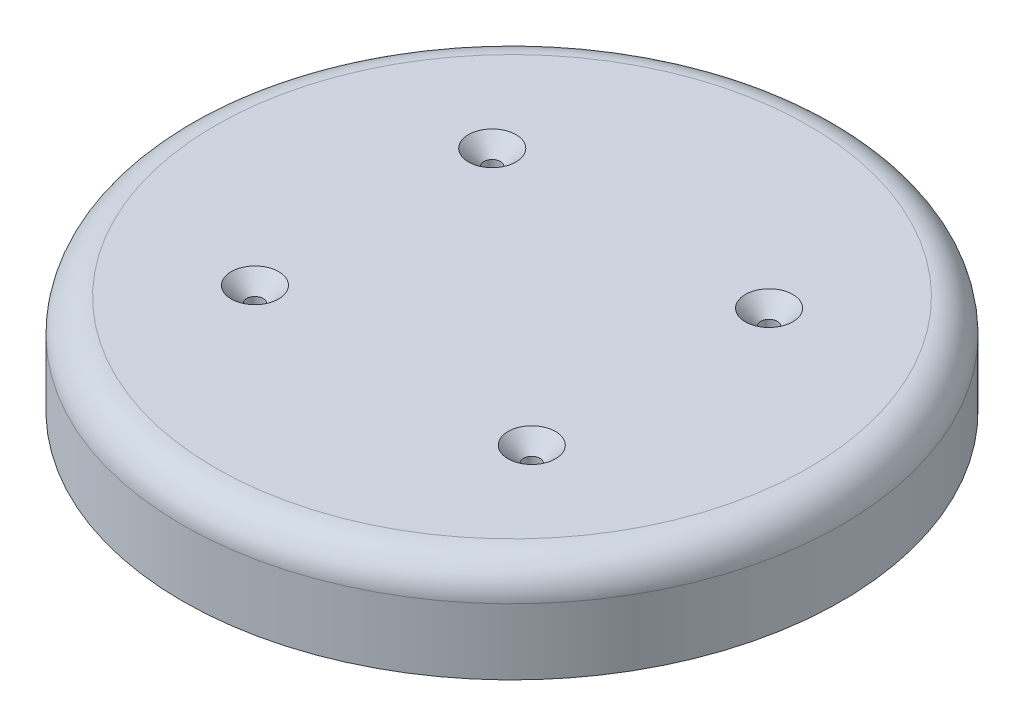
ISO-10303-21;
HEADER;
FILE_DESCRIPTION(('STEP AP214'),'2;1');
FILE_NAME('part.step','',(''),(''),'','','');
FILE_SCHEMA(('AUTOMOTIVE_DESIGN { 1 0 10303 214 1 1 1 1 }'));
ENDSEC;
DATA;
#1=APPLICATION_CONTEXT('core data for automotive mechanical design processes');
#2=APPLICATION_PROTOCOL_DEFINITION('international standard','automotive_design',2000,#1);
#3=PRODUCT_CONTEXT('',#1,'mechanical');
#4=PRODUCT('Part','Part','',(#3));
#5=PRODUCT_RELATED_PRODUCT_CATEGORY('part','',(#4));
#6=PRODUCT_DEFINITION_FORMATION('','',#4);
#7=PRODUCT_DEFINITION_CONTEXT('part definition',#1,'design');
#8=PRODUCT_DEFINITION('design','',#6,#7);
#9=PRODUCT_DEFINITION_SHAPE('','',#8);
#10=(LENGTH_UNIT() NAMED_UNIT(*) SI_UNIT(.MILLI.,.METRE.));
#11=(NAMED_UNIT(*) PLANE_ANGLE_UNIT() SI_UNIT($,.RADIAN.));
#12=(NAMED_UNIT(*) SI_UNIT($,.STERADIAN.) SOLID_ANGLE_UNIT());
#13=UNCERTAINTY_MEASURE_WITH_UNIT(LENGTH_MEASURE(1.E-05),#10,'distance_accuracy_value','');
#14=(GEOMETRIC_REPRESENTATION_CONTEXT(3) GLOBAL_UNCERTAINTY_ASSIGNED_CONTEXT((#13)) GLOBAL_UNIT_ASSIGNED_CONTEXT((#10,
#11,#12)) REPRESENTATION_CONTEXT('',''));
#15=CARTESIAN_POINT('',(0.,0.,0.));
#16=DIRECTION('',(0.,0.,1.));
#17=DIRECTION('',(1.,0.,0.));
#18=AXIS2_PLACEMENT_3D('',#15,#16,#17);
#19=CARTESIAN_POINT('',(-21.,0.,-18.));
#20=DIRECTION('',(0.,1.,0.));
#21=DIRECTION('',(0.,0.,1.));
#22=AXIS2_PLACEMENT_3D('',#19,#20,#21);
#23=PLANE('',#22);
#24=CARTESIAN_POINT('',(-21.,0.,-18.));
#25=DIRECTION('',(0.,1.,0.));
#26=DIRECTION('',(0.,0.,1.));
#27=AXIS2_PLACEMENT_3D('',#24,#25,#26);
#28=CIRCLE('',#27,1.25);
#29=CARTESIAN_POINT('',(-21.,0.,-16.75));
#30=VERTEX_POINT('',#29);
#31=EDGE_CURVE('E120',#30,#30,#28,.T.);
#32=ORIENTED_EDGE('',*,*,#31,.T.);
#33=EDGE_LOOP('',(#32));
#34=FACE_BOUND('',#33,.T.);
#35=CARTESIAN_POINT('',(-21.,0.,-18.));
#36=DIRECTION('',(0.,1.,0.));
#37=DIRECTION('',(0.,0.,1.));
#38=AXIS2_PLACEMENT_3D('',#35,#36,#37);
#39=CIRCLE('',#38,2.75);
#40=CARTESIAN_POINT('',(-21.,0.,-15.25));
#41=VERTEX_POINT('',#40);
#42=EDGE_CURVE('E116',#41,#41,#39,.T.);
#43=ORIENTED_EDGE('',*,*,#42,.F.);
#44=EDGE_LOOP('',(#43));
#45=FACE_BOUND('',#44,.T.);
#46=ADVANCED_FACE('F44',(#34,#45),#23,.F.);
#47=CARTESIAN_POINT('',(-21.,0.,-18.));
#48=DIRECTION('',(0.,1.,0.));
#49=DIRECTION('',(0.,0.,1.));
#50=AXIS2_PLACEMENT_3D('',#47,#48,#49);
#51=CYLINDRICAL_SURFACE('',#50,1.25);
#52=CARTESIAN_POINT('',(-21.,12.65,-18.));
#53=DIRECTION('',(0.,1.,0.));
#54=DIRECTION('',(0.,0.,1.));
#55=AXIS2_PLACEMENT_3D('',#52,#53,#54);
#56=CIRCLE('',#55,1.25);
#57=CARTESIAN_POINT('',(-21.,12.65,-16.75));
#58=VERTEX_POINT('',#57);
#59=EDGE_CURVE('E84',#58,#58,#56,.T.);
#60=ORIENTED_EDGE('',*,*,#59,.T.);
#61=EDGE_LOOP('',(#60));
#62=FACE_BOUND('',#61,.T.);
#63=ORIENTED_EDGE('',*,*,#31,.F.);
#64=EDGE_LOOP('',(#63));
#65=FACE_BOUND('',#64,.T.);
#66=ADVANCED_FACE('F196',(#62,#65),#51,.F.);
#67=CARTESIAN_POINT('',(-21.,0.,-18.));
#68=DIRECTION('',(0.,1.,0.));
#69=DIRECTION('',(0.,0.,1.));
#70=AXIS2_PLACEMENT_3D('',#67,#68,#69);
#71=CYLINDRICAL_SURFACE('',#70,2.75);
#72=CARTESIAN_POINT('',(-21.,8.,-18.));
#73=DIRECTION('',(0.,1.,0.));
#74=DIRECTION('',(0.,0.,1.));
#75=AXIS2_PLACEMENT_3D('',#72,#73,#74);
#76=CIRCLE('',#75,2.75);
#77=CARTESIAN_POINT('',(-21.,8.,-15.25));
#78=VERTEX_POINT('',#77);
#79=EDGE_CURVE('E52',#78,#78,#76,.F.);
#80=ORIENTED_EDGE('',*,*,#79,.T.);
#81=EDGE_LOOP('',(#80));
#82=FACE_BOUND('',#81,.T.);
#83=ORIENTED_EDGE('',*,*,#42,.T.);
#84=EDGE_LOOP('',(#83));
#85=FACE_BOUND('',#84,.T.);
#86=ADVANCED_FACE('F193',(#82,#85),#71,.T.);
#87=CARTESIAN_POINT('',(0.,0.,0.));
#88=DIRECTION('',(0.,1.,0.));
#89=DIRECTION('',(0.,0.,1.));
#90=AXIS2_PLACEMENT_3D('',#87,#88,#89);
#91=PLANE('',#90);
#92=CARTESIAN_POINT('',(0.,0.,0.));
#93=DIRECTION('',(0.,1.,0.));
#94=DIRECTION('',(0.,0.,1.));
#95=AXIS2_PLACEMENT_3D('',#92,#93,#94);
#96=CIRCLE('',#95,47.);
#97=CARTESIAN_POINT('',(0.,0.,47.));
#98=VERTEX_POINT('',#97);
#99=EDGE_CURVE('E124',#98,#98,#96,.T.);
#100=ORIENTED_EDGE('',*,*,#99,.T.);
#101=EDGE_LOOP('',(#100));
#102=FACE_BOUND('',#101,.T.);
#103=CARTESIAN_POINT('',(0.,0.,0.));
#104=DIRECTION('',(0.,1.,0.));
#105=DIRECTION('',(0.,0.,1.));
#106=AXIS2_PLACEMENT_3D('',#103,#104,#105);
#107=CIRCLE('',#106,50.);
#108=CARTESIAN_POINT('',(0.,0.,50.));
#109=VERTEX_POINT('',#108);
#110=EDGE_CURVE('E128',#109,#109,#107,.T.);
#111=ORIENTED_EDGE('',*,*,#110,.F.);
#112=EDGE_LOOP('',(#111));
#113=FACE_BOUND('',#112,.T.);
#114=ADVANCED_FACE('F195',(#102,#113),#91,.F.);
#115=CARTESIAN_POINT('',(0.,15.,0.));
#116=DIRECTION('',(0.,-1.,0.));
#117=DIRECTION('',(0.,0.,-1.));
#118=AXIS2_PLACEMENT_3D('',#115,#116,#117);
#119=CYLINDRICAL_SURFACE('',#118,47.);
#120=CARTESIAN_POINT('',(0.,7.,0.));
#121=DIRECTION('',(0.,1.,0.));
#122=DIRECTION('',(0.,0.,1.));
#123=AXIS2_PLACEMENT_3D('',#120,#121,#122);
#124=CIRCLE('',#123,47.);
#125=CARTESIAN_POINT('',(0.,7.,47.));
#126=VERTEX_POINT('',#125);
#127=EDGE_CURVE('E140',#126,#126,#124,.T.);
#128=ORIENTED_EDGE('',*,*,#127,.T.);
#129=EDGE_LOOP('',(#128));
#130=FACE_BOUND('',#129,.T.);
#131=ORIENTED_EDGE('',*,*,#99,.F.);
#132=EDGE_LOOP('',(#131));
#133=FACE_BOUND('',#132,.T.);
#134=ADVANCED_FACE('F203',(#130,#133),#119,.F.);
#135=CARTESIAN_POINT('',(0.,7.,0.));
#136=DIRECTION('',(0.,1.,0.));
#137=DIRECTION('',(0.,0.,1.));
#138=AXIS2_PLACEMENT_3D('',#135,#136,#137);
#139=TOROIDAL_SURFACE('',#138,42.,5.);
#140=CARTESIAN_POINT('',(0.,12.,0.));
#141=DIRECTION('',(0.,1.,0.));
#142=DIRECTION('',(0.,0.,1.));
#143=AXIS2_PLACEMENT_3D('',#140,#141,#142);
#144=CIRCLE('',#143,42.);
#145=CARTESIAN_POINT('',(0.,12.,42.));
#146=VERTEX_POINT('',#145);
#147=EDGE_CURVE('E144',#146,#146,#144,.F.);
#148=ORIENTED_EDGE('',*,*,#147,.F.);
#149=EDGE_LOOP('',(#148));
#150=FACE_BOUND('',#149,.T.);
#151=ORIENTED_EDGE('',*,*,#127,.F.);
#152=EDGE_LOOP('',(#151));
#153=FACE_BOUND('',#152,.T.);
#154=ADVANCED_FACE('F258',(#150,#153),#139,.F.);
#155=CARTESIAN_POINT('',(0.,12.,0.));
#156=DIRECTION('',(0.,1.,0.));
#157=DIRECTION('',(0.,0.,1.));
#158=AXIS2_PLACEMENT_3D('',#155,#156,#157);
#159=PLANE('',#158);
#160=CARTESIAN_POINT('',(21.,12.,18.));
#161=DIRECTION('',(0.,1.,0.));
#162=DIRECTION('',(0.,0.,1.));
#163=AXIS2_PLACEMENT_3D('',#160,#161,#162);
#164=CIRCLE('',#163,6.75);
#165=CARTESIAN_POINT('',(21.,12.,24.75));
#166=VERTEX_POINT('',#165);
#167=EDGE_CURVE('E68',#166,#166,#164,.T.);
#168=ORIENTED_EDGE('',*,*,#167,.T.);
#169=EDGE_LOOP('',(#168));
#170=FACE_BOUND('',#169,.T.);
#171=CARTESIAN_POINT('',(-21.,12.,18.));
#172=DIRECTION('',(0.,1.,0.));
#173=DIRECTION('',(0.,0.,1.));
#174=AXIS2_PLACEMENT_3D('',#171,#172,#173);
#175=CIRCLE('',#174,6.75);
#176=CARTESIAN_POINT('',(-21.,12.,24.75));
#177=VERTEX_POINT('',#176);
#178=EDGE_CURVE('E72',#177,#177,#175,.T.);
#179=ORIENTED_EDGE('',*,*,#178,.T.);
#180=EDGE_LOOP('',(#179));
#181=FACE_BOUND('',#180,.T.);
#182=CARTESIAN_POINT('',(-21.,12.,-18.));
#183=DIRECTION('',(0.,1.,0.));
#184=DIRECTION('',(0.,0.,1.));
#185=AXIS2_PLACEMENT_3D('',#182,#183,#184);
#186=CIRCLE('',#185,6.75);
#187=CARTESIAN_POINT('',(-21.,12.,-11.25));
#188=VERTEX_POINT('',#187);
#189=EDGE_CURVE('E76',#188,#188,#186,.T.);
#190=ORIENTED_EDGE('',*,*,#189,.T.);
#191=EDGE_LOOP('',(#190));
#192=FACE_BOUND('',#191,.T.);
#193=CARTESIAN_POINT('',(21.,12.,-18.));
#194=DIRECTION('',(0.,1.,0.));
#195=DIRECTION('',(0.,0.,1.));
#196=AXIS2_PLACEMENT_3D('',#193,#194,#195);
#197=CIRCLE('',#196,6.75);
#198=CARTESIAN_POINT('',(21.,12.,-11.25));
#199=VERTEX_POINT('',#198);
#200=EDGE_CURVE('E80',#199,#199,#197,.T.);
#201=ORIENTED_EDGE('',*,*,#200,.T.);
#202=EDGE_LOOP('',(#201));
#203=FACE_BOUND('',#202,.T.);
#204=ORIENTED_EDGE('',*,*,#147,.T.);
#205=EDGE_LOOP('',(#204));
#206=FACE_BOUND('',#205,.T.);
#207=ADVANCED_FACE('F255',(#170,#181,#192,#203,#206),#159,.F.);
#208=CARTESIAN_POINT('',(0.,15.,0.));
#209=DIRECTION('',(0.,-1.,0.));
#210=DIRECTION('',(0.,0.,-1.));
#211=AXIS2_PLACEMENT_3D('',#208,#209,#210);
#212=CYLINDRICAL_SURFACE('',#211,50.);
#213=CARTESIAN_POINT('',(0.,10.,0.));
#214=DIRECTION('',(0.,1.,0.));
#215=DIRECTION('',(0.,0.,1.));
#216=AXIS2_PLACEMENT_3D('',#213,#214,#215);
#217=CIRCLE('',#216,50.);
#218=CARTESIAN_POINT('',(0.,10.,50.));
#219=VERTEX_POINT('',#218);
#220=EDGE_CURVE('E136',#219,#219,#217,.F.);
#221=ORIENTED_EDGE('',*,*,#220,.T.);
#222=EDGE_LOOP('',(#221));
#223=FACE_BOUND('',#222,.T.);
#224=ORIENTED_EDGE('',*,*,#110,.T.);
#225=EDGE_LOOP('',(#224));
#226=FACE_BOUND('',#225,.T.);
#227=ADVANCED_FACE('F257',(#223,#226),#212,.T.);
#228=CARTESIAN_POINT('',(0.,10.,0.));
#229=DIRECTION('',(0.,1.,0.));
#230=DIRECTION('',(0.,0.,1.));
#231=AXIS2_PLACEMENT_3D('',#228,#229,#230);
#232=TOROIDAL_SURFACE('',#231,45.,5.);
#233=ORIENTED_EDGE('',*,*,#220,.F.);
#234=EDGE_LOOP('',(#233));
#235=FACE_BOUND('',#234,.T.);
#236=CARTESIAN_POINT('',(0.,15.,0.));
#237=DIRECTION('',(0.,1.,0.));
#238=DIRECTION('',(0.,0.,1.));
#239=AXIS2_PLACEMENT_3D('',#236,#237,#238);
#240=CIRCLE('',#239,45.);
#241=CARTESIAN_POINT('',(0.,15.,45.));
#242=VERTEX_POINT('',#241);
#243=EDGE_CURVE('E132',#242,#242,#240,.T.);
#244=ORIENTED_EDGE('',*,*,#243,.F.);
#245=EDGE_LOOP('',(#244));
#246=FACE_BOUND('',#245,.T.);
#247=ADVANCED_FACE('F278',(#235,#246),#232,.T.);
#248=CARTESIAN_POINT('',(0.,15.,0.));
#249=DIRECTION('',(0.,1.,0.));
#250=DIRECTION('',(0.,0.,1.));
#251=AXIS2_PLACEMENT_3D('',#248,#249,#250);
#252=PLANE('',#251);
#253=CARTESIAN_POINT('',(21.,15.,-18.));
#254=DIRECTION('',(0.,1.,0.));
#255=DIRECTION('',(0.,0.,1.));
#256=AXIS2_PLACEMENT_3D('',#253,#254,#255);
#257=CIRCLE('',#256,3.60000000000006);
#258=CARTESIAN_POINT('',(21.,15.,-14.3999999999999));
#259=VERTEX_POINT('',#258);
#260=EDGE_CURVE('E96',#259,#259,#257,.F.);
#261=ORIENTED_EDGE('',*,*,#260,.T.);
#262=EDGE_LOOP('',(#261));
#263=FACE_BOUND('',#262,.T.);
#264=CARTESIAN_POINT('',(21.,15.,18.));
#265=DIRECTION('',(0.,1.,0.));
#266=DIRECTION('',(0.,0.,1.));
#267=AXIS2_PLACEMENT_3D('',#264,#265,#266);
#268=CIRCLE('',#267,3.60000000000006);
#269=CARTESIAN_POINT('',(21.,15.,21.6000000000001));
#270=VERTEX_POINT('',#269);
#271=EDGE_CURVE('E100',#270,#270,#268,.F.);
#272=ORIENTED_EDGE('',*,*,#271,.T.);
#273=EDGE_LOOP('',(#272));
#274=FACE_BOUND('',#273,.T.);
#275=CARTESIAN_POINT('',(-21.,15.,18.));
#276=DIRECTION('',(0.,1.,0.));
#277=DIRECTION('',(0.,0.,1.));
#278=AXIS2_PLACEMENT_3D('',#275,#276,#277);
#279=CIRCLE('',#278,3.60000000000006);
#280=CARTESIAN_POINT('',(-21.,15.,21.6000000000001));
#281=VERTEX_POINT('',#280);
#282=EDGE_CURVE('E104',#281,#281,#279,.F.);
#283=ORIENTED_EDGE('',*,*,#282,.T.);
#284=EDGE_LOOP('',(#283));
#285=FACE_BOUND('',#284,.T.);
#286=CARTESIAN_POINT('',(-21.,15.,-18.));
#287=DIRECTION('',(0.,1.,0.));
#288=DIRECTION('',(0.,0.,1.));
#289=AXIS2_PLACEMENT_3D('',#286,#287,#288);
#290=CIRCLE('',#289,3.60000000000002);
#291=CARTESIAN_POINT('',(-21.,15.,-14.4));
#292=VERTEX_POINT('',#291);
#293=EDGE_CURVE('E108',#292,#292,#290,.F.);
#294=ORIENTED_EDGE('',*,*,#293,.T.);
#295=EDGE_LOOP('',(#294));
#296=FACE_BOUND('',#295,.T.);
#297=ORIENTED_EDGE('',*,*,#243,.T.);
#298=EDGE_LOOP('',(#297));
#299=FACE_BOUND('',#298,.T.);
#300=ADVANCED_FACE('F284',(#263,#274,#285,#296,#299),#252,.T.);
#301=CARTESIAN_POINT('',(21.,0.,-18.));
#302=DIRECTION('',(0.,1.,0.));
#303=DIRECTION('',(0.,0.,1.));
#304=AXIS2_PLACEMENT_3D('',#301,#302,#303);
#305=PLANE('',#304);
#306=CARTESIAN_POINT('',(21.,0.,-18.));
#307=DIRECTION('',(0.,1.,0.));
#308=DIRECTION('',(0.,0.,1.));
#309=AXIS2_PLACEMENT_3D('',#306,#307,#308);
#310=CIRCLE('',#309,1.25);
#311=CARTESIAN_POINT('',(21.,0.,-16.75));
#312=VERTEX_POINT('',#311);
#313=EDGE_CURVE('E152',#312,#312,#310,.T.);
#314=ORIENTED_EDGE('',*,*,#313,.T.);
#315=EDGE_LOOP('',(#314));
#316=FACE_BOUND('',#315,.T.);
#317=CARTESIAN_POINT('',(21.,0.,-18.));
#318=DIRECTION('',(0.,1.,0.));
#319=DIRECTION('',(0.,0.,1.));
#320=AXIS2_PLACEMENT_3D('',#317,#318,#319);
#321=CIRCLE('',#320,2.75);
#322=CARTESIAN_POINT('',(21.,0.,-15.25));
#323=VERTEX_POINT('',#322);
#324=EDGE_CURVE('E148',#323,#323,#321,.T.);
#325=ORIENTED_EDGE('',*,*,#324,.F.);
#326=EDGE_LOOP('',(#325));
#327=FACE_BOUND('',#326,.T.);
#328=ADVANCED_FACE('F206',(#316,#327),#305,.F.);
#329=CARTESIAN_POINT('',(21.,0.,-18.));
#330=DIRECTION('',(0.,1.,0.));
#331=DIRECTION('',(0.,0.,1.));
#332=AXIS2_PLACEMENT_3D('',#329,#330,#331);
#333=CYLINDRICAL_SURFACE('',#332,1.25);
#334=CARTESIAN_POINT('',(21.,12.6499999999999,-18.));
#335=DIRECTION('',(0.,1.,0.));
#336=DIRECTION('',(0.,0.,1.));
#337=AXIS2_PLACEMENT_3D('',#334,#335,#336);
#338=CIRCLE('',#337,1.25);
#339=CARTESIAN_POINT('',(21.,12.6499999999999,-16.75));
#340=VERTEX_POINT('',#339);
#341=EDGE_CURVE('E112',#340,#340,#338,.T.);
#342=ORIENTED_EDGE('',*,*,#341,.T.);
#343=EDGE_LOOP('',(#342));
#344=FACE_BOUND('',#343,.T.);
#345=ORIENTED_EDGE('',*,*,#313,.F.);
#346=EDGE_LOOP('',(#345));
#347=FACE_BOUND('',#346,.T.);
#348=ADVANCED_FACE('F294',(#344,#347),#333,.F.);
#349=CARTESIAN_POINT('',(21.,0.,-18.));
#350=DIRECTION('',(0.,1.,0.));
#351=DIRECTION('',(0.,0.,1.));
#352=AXIS2_PLACEMENT_3D('',#349,#350,#351);
#353=CYLINDRICAL_SURFACE('',#352,2.75);
#354=CARTESIAN_POINT('',(21.,8.,-18.));
#355=DIRECTION('',(0.,1.,0.));
#356=DIRECTION('',(0.,0.,1.));
#357=AXIS2_PLACEMENT_3D('',#354,#355,#356);
#358=CIRCLE('',#357,2.75);
#359=CARTESIAN_POINT('',(21.,8.,-15.25));
#360=VERTEX_POINT('',#359);
#361=EDGE_CURVE('E10',#360,#360,#358,.F.);
#362=ORIENTED_EDGE('',*,*,#361,.T.);
#363=EDGE_LOOP('',(#362));
#364=FACE_BOUND('',#363,.T.);
#365=ORIENTED_EDGE('',*,*,#324,.T.);
#366=EDGE_LOOP('',(#365));
#367=FACE_BOUND('',#366,.T.);
#368=ADVANCED_FACE('F333',(#364,#367),#353,.T.);
#369=CARTESIAN_POINT('',(21.,0.,18.));
#370=DIRECTION('',(0.,1.,0.));
#371=DIRECTION('',(0.,0.,1.));
#372=AXIS2_PLACEMENT_3D('',#369,#370,#371);
#373=PLANE('',#372);
#374=CARTESIAN_POINT('',(21.,0.,18.));
#375=DIRECTION('',(0.,1.,0.));
#376=DIRECTION('',(0.,0.,1.));
#377=AXIS2_PLACEMENT_3D('',#374,#375,#376);
#378=CIRCLE('',#377,1.25);
#379=CARTESIAN_POINT('',(21.,0.,19.25));
#380=VERTEX_POINT('',#379);
#381=EDGE_CURVE('E160',#380,#380,#378,.T.);
#382=ORIENTED_EDGE('',*,*,#381,.T.);
#383=EDGE_LOOP('',(#382));
#384=FACE_BOUND('',#383,.T.);
#385=CARTESIAN_POINT('',(21.,0.,18.));
#386=DIRECTION('',(0.,1.,0.));
#387=DIRECTION('',(0.,0.,1.));
#388=AXIS2_PLACEMENT_3D('',#385,#386,#387);
#389=CIRCLE('',#388,2.75);
#390=CARTESIAN_POINT('',(21.,0.,20.75));
#391=VERTEX_POINT('',#390);
#392=EDGE_CURVE('E156',#391,#391,#389,.T.);
#393=ORIENTED_EDGE('',*,*,#392,.F.);
#394=EDGE_LOOP('',(#393));
#395=FACE_BOUND('',#394,.T.);
#396=ADVANCED_FACE('F189',(#384,#395),#373,.F.);
#397=CARTESIAN_POINT('',(21.,0.,18.));
#398=DIRECTION('',(0.,1.,0.));
#399=DIRECTION('',(0.,0.,1.));
#400=AXIS2_PLACEMENT_3D('',#397,#398,#399);
#401=CYLINDRICAL_SURFACE('',#400,1.25);
#402=CARTESIAN_POINT('',(21.,12.6499999999999,18.));
#403=DIRECTION('',(0.,1.,0.));
#404=DIRECTION('',(0.,0.,1.));
#405=AXIS2_PLACEMENT_3D('',#402,#403,#404);
#406=CIRCLE('',#405,1.25);
#407=CARTESIAN_POINT('',(21.,12.6499999999999,19.25));
#408=VERTEX_POINT('',#407);
#409=EDGE_CURVE('E92',#408,#408,#406,.T.);
#410=ORIENTED_EDGE('',*,*,#409,.T.);
#411=EDGE_LOOP('',(#410));
#412=FACE_BOUND('',#411,.T.);
#413=ORIENTED_EDGE('',*,*,#381,.F.);
#414=EDGE_LOOP('',(#413));
#415=FACE_BOUND('',#414,.T.);
#416=ADVANCED_FACE('F362',(#412,#415),#401,.F.);
#417=CARTESIAN_POINT('',(21.,0.,18.));
#418=DIRECTION('',(0.,1.,0.));
#419=DIRECTION('',(0.,0.,1.));
#420=AXIS2_PLACEMENT_3D('',#417,#418,#419);
#421=CYLINDRICAL_SURFACE('',#420,2.75);
#422=CARTESIAN_POINT('',(21.,8.,18.));
#423=DIRECTION('',(0.,1.,0.));
#424=DIRECTION('',(0.,0.,1.));
#425=AXIS2_PLACEMENT_3D('',#422,#423,#424);
#426=CIRCLE('',#425,2.75);
#427=CARTESIAN_POINT('',(21.,8.,20.75));
#428=VERTEX_POINT('',#427);
#429=EDGE_CURVE('E62',#428,#428,#426,.F.);
#430=ORIENTED_EDGE('',*,*,#429,.T.);
#431=EDGE_LOOP('',(#430));
#432=FACE_BOUND('',#431,.T.);
#433=ORIENTED_EDGE('',*,*,#392,.T.);
#434=EDGE_LOOP('',(#433));
#435=FACE_BOUND('',#434,.T.);
#436=ADVANCED_FACE('F191',(#432,#435),#421,.T.);
#437=CARTESIAN_POINT('',(-21.,0.,18.));
#438=DIRECTION('',(0.,1.,0.));
#439=DIRECTION('',(0.,0.,1.));
#440=AXIS2_PLACEMENT_3D('',#437,#438,#439);
#441=PLANE('',#440);
#442=CARTESIAN_POINT('',(-21.,0.,18.));
#443=DIRECTION('',(0.,1.,0.));
#444=DIRECTION('',(0.,0.,1.));
#445=AXIS2_PLACEMENT_3D('',#442,#443,#444);
#446=CIRCLE('',#445,1.25);
#447=CARTESIAN_POINT('',(-21.,0.,19.25));
#448=VERTEX_POINT('',#447);
#449=EDGE_CURVE('E168',#448,#448,#446,.T.);
#450=ORIENTED_EDGE('',*,*,#449,.T.);
#451=EDGE_LOOP('',(#450));
#452=FACE_BOUND('',#451,.T.);
#453=CARTESIAN_POINT('',(-21.,0.,18.));
#454=DIRECTION('',(0.,1.,0.));
#455=DIRECTION('',(0.,0.,1.));
#456=AXIS2_PLACEMENT_3D('',#453,#454,#455);
#457=CIRCLE('',#456,2.75);
#458=CARTESIAN_POINT('',(-21.,0.,20.75));
#459=VERTEX_POINT('',#458);
#460=EDGE_CURVE('E164',#459,#459,#457,.T.);
#461=ORIENTED_EDGE('',*,*,#460,.F.);
#462=EDGE_LOOP('',(#461));
#463=FACE_BOUND('',#462,.T.);
#464=ADVANCED_FACE('F173',(#452,#463),#441,.F.);
#465=CARTESIAN_POINT('',(-21.,0.,18.));
#466=DIRECTION('',(0.,1.,0.));
#467=DIRECTION('',(0.,0.,1.));
#468=AXIS2_PLACEMENT_3D('',#465,#466,#467);
#469=CYLINDRICAL_SURFACE('',#468,1.25);
#470=CARTESIAN_POINT('',(-21.,12.6499999999999,18.));
#471=DIRECTION('',(0.,1.,0.));
#472=DIRECTION('',(0.,0.,1.));
#473=AXIS2_PLACEMENT_3D('',#470,#471,#472);
#474=CIRCLE('',#473,1.25);
#475=CARTESIAN_POINT('',(-21.,12.6499999999999,19.25));
#476=VERTEX_POINT('',#475);
#477=EDGE_CURVE('E88',#476,#476,#474,.T.);
#478=ORIENTED_EDGE('',*,*,#477,.T.);
#479=EDGE_LOOP('',(#478));
#480=FACE_BOUND('',#479,.T.);
#481=ORIENTED_EDGE('',*,*,#449,.F.);
#482=EDGE_LOOP('',(#481));
#483=FACE_BOUND('',#482,.T.);
#484=ADVANCED_FACE('F176',(#480,#483),#469,.F.);
#485=CARTESIAN_POINT('',(-21.,0.,18.));
#486=DIRECTION('',(0.,1.,0.));
#487=DIRECTION('',(0.,0.,1.));
#488=AXIS2_PLACEMENT_3D('',#485,#486,#487);
#489=CYLINDRICAL_SURFACE('',#488,2.75);
#490=CARTESIAN_POINT('',(-21.,8.,18.));
#491=DIRECTION('',(0.,1.,0.));
#492=DIRECTION('',(0.,0.,1.));
#493=AXIS2_PLACEMENT_3D('',#490,#491,#492);
#494=CIRCLE('',#493,2.75);
#495=CARTESIAN_POINT('',(-21.,8.,20.75));
#496=VERTEX_POINT('',#495);
#497=EDGE_CURVE('E57',#496,#496,#494,.F.);
#498=ORIENTED_EDGE('',*,*,#497,.T.);
#499=EDGE_LOOP('',(#498));
#500=FACE_BOUND('',#499,.T.);
#501=ORIENTED_EDGE('',*,*,#460,.T.);
#502=EDGE_LOOP('',(#501));
#503=FACE_BOUND('',#502,.T.);
#504=ADVANCED_FACE('F178',(#500,#503),#489,.T.);
#505=CARTESIAN_POINT('',(21.,12.6499999999999,-18.));
#506=DIRECTION('',(0.,1.,0.));
#507=DIRECTION('',(0.,0.,1.));
#508=AXIS2_PLACEMENT_3D('',#505,#506,#507);
#509=CONICAL_SURFACE('',#508,1.25,0.78539816339745);
#510=ORIENTED_EDGE('',*,*,#260,.F.);
#511=EDGE_LOOP('',(#510));
#512=FACE_BOUND('',#511,.T.);
#513=ORIENTED_EDGE('',*,*,#341,.F.);
#514=EDGE_LOOP('',(#513));
#515=FACE_BOUND('',#514,.T.);
#516=ADVANCED_FACE('F186',(#512,#515),#509,.F.);
#517=CARTESIAN_POINT('',(21.,12.6499999999999,18.));
#518=DIRECTION('',(0.,1.,0.));
#519=DIRECTION('',(0.,0.,1.));
#520=AXIS2_PLACEMENT_3D('',#517,#518,#519);
#521=CONICAL_SURFACE('',#520,1.25,0.78539816339745);
#522=ORIENTED_EDGE('',*,*,#271,.F.);
#523=EDGE_LOOP('',(#522));
#524=FACE_BOUND('',#523,.T.);
#525=ORIENTED_EDGE('',*,*,#409,.F.);
#526=EDGE_LOOP('',(#525));
#527=FACE_BOUND('',#526,.T.);
#528=ADVANCED_FACE('F218',(#524,#527),#521,.F.);
#529=CARTESIAN_POINT('',(-21.,12.6499999999999,18.));
#530=DIRECTION('',(0.,1.,0.));
#531=DIRECTION('',(0.,0.,1.));
#532=AXIS2_PLACEMENT_3D('',#529,#530,#531);
#533=CONICAL_SURFACE('',#532,1.25,0.78539816339745);
#534=ORIENTED_EDGE('',*,*,#282,.F.);
#535=EDGE_LOOP('',(#534));
#536=FACE_BOUND('',#535,.T.);
#537=ORIENTED_EDGE('',*,*,#477,.F.);
#538=EDGE_LOOP('',(#537));
#539=FACE_BOUND('',#538,.T.);
#540=ADVANCED_FACE('F225',(#536,#539),#533,.F.);
#541=CARTESIAN_POINT('',(-21.,12.65,-18.));
#542=DIRECTION('',(0.,1.,0.));
#543=DIRECTION('',(0.,0.,1.));
#544=AXIS2_PLACEMENT_3D('',#541,#542,#543);
#545=CONICAL_SURFACE('',#544,1.25,0.78539816339745);
#546=ORIENTED_EDGE('',*,*,#293,.F.);
#547=EDGE_LOOP('',(#546));
#548=FACE_BOUND('',#547,.T.);
#549=ORIENTED_EDGE('',*,*,#59,.F.);
#550=EDGE_LOOP('',(#549));
#551=FACE_BOUND('',#550,.T.);
#552=ADVANCED_FACE('F232',(#548,#551),#545,.F.);
#553=CARTESIAN_POINT('',(21.,8.,18.));
#554=DIRECTION('',(0.,1.,0.));
#555=DIRECTION('',(0.,0.,1.));
#556=AXIS2_PLACEMENT_3D('',#553,#554,#555);
#557=TOROIDAL_SURFACE('',#556,6.75,4.);
#558=ORIENTED_EDGE('',*,*,#429,.F.);
#559=EDGE_LOOP('',(#558));
#560=FACE_BOUND('',#559,.T.);
#561=ORIENTED_EDGE('',*,*,#167,.F.);
#562=EDGE_LOOP('',(#561));
#563=FACE_BOUND('',#562,.T.);
#564=ADVANCED_FACE('F237',(#560,#563),#557,.F.);
#565=CARTESIAN_POINT('',(-21.,8.,18.));
#566=DIRECTION('',(0.,1.,0.));
#567=DIRECTION('',(0.,0.,1.));
#568=AXIS2_PLACEMENT_3D('',#565,#566,#567);
#569=TOROIDAL_SURFACE('',#568,6.75,4.);
#570=ORIENTED_EDGE('',*,*,#497,.F.);
#571=EDGE_LOOP('',(#570));
#572=FACE_BOUND('',#571,.T.);
#573=ORIENTED_EDGE('',*,*,#178,.F.);
#574=EDGE_LOOP('',(#573));
#575=FACE_BOUND('',#574,.T.);
#576=ADVANCED_FACE('F241',(#572,#575),#569,.F.);
#577=CARTESIAN_POINT('',(-21.,8.,-18.));
#578=DIRECTION('',(0.,1.,0.));
#579=DIRECTION('',(0.,0.,1.));
#580=AXIS2_PLACEMENT_3D('',#577,#578,#579);
#581=TOROIDAL_SURFACE('',#580,6.75,4.);
#582=ORIENTED_EDGE('',*,*,#79,.F.);
#583=EDGE_LOOP('',(#582));
#584=FACE_BOUND('',#583,.T.);
#585=ORIENTED_EDGE('',*,*,#189,.F.);
#586=EDGE_LOOP('',(#585));
#587=FACE_BOUND('',#586,.T.);
#588=ADVANCED_FACE('F244',(#584,#587),#581,.F.);
#589=CARTESIAN_POINT('',(21.,8.,-18.));
#590=DIRECTION('',(0.,1.,0.));
#591=DIRECTION('',(0.,0.,1.));
#592=AXIS2_PLACEMENT_3D('',#589,#590,#591);
#593=TOROIDAL_SURFACE('',#592,6.75,4.);
#594=ORIENTED_EDGE('',*,*,#361,.F.);
#595=EDGE_LOOP('',(#594));
#596=FACE_BOUND('',#595,.T.);
#597=ORIENTED_EDGE('',*,*,#200,.F.);
#598=EDGE_LOOP('',(#597));
#599=FACE_BOUND('',#598,.T.);
#600=ADVANCED_FACE('F46',(#596,#599),#593,.F.);
#601=CLOSED_SHELL('',(#46,#66,#86,#114,#134,#154,#207,#227,#247,#300,#328,#348,#368,#396,#416,
#436,#464,#484,#504,#516,#528,#540,#552,#564,#576,#588,#600));
#602=MANIFOLD_SOLID_BREP('B2',#601);
#603=ADVANCED_BREP_SHAPE_REPRESENTATION('',(#18,#602),#14);
#604=SHAPE_DEFINITION_REPRESENTATION(#9,#603);
ENDSEC;
END-ISO-10303-21;
